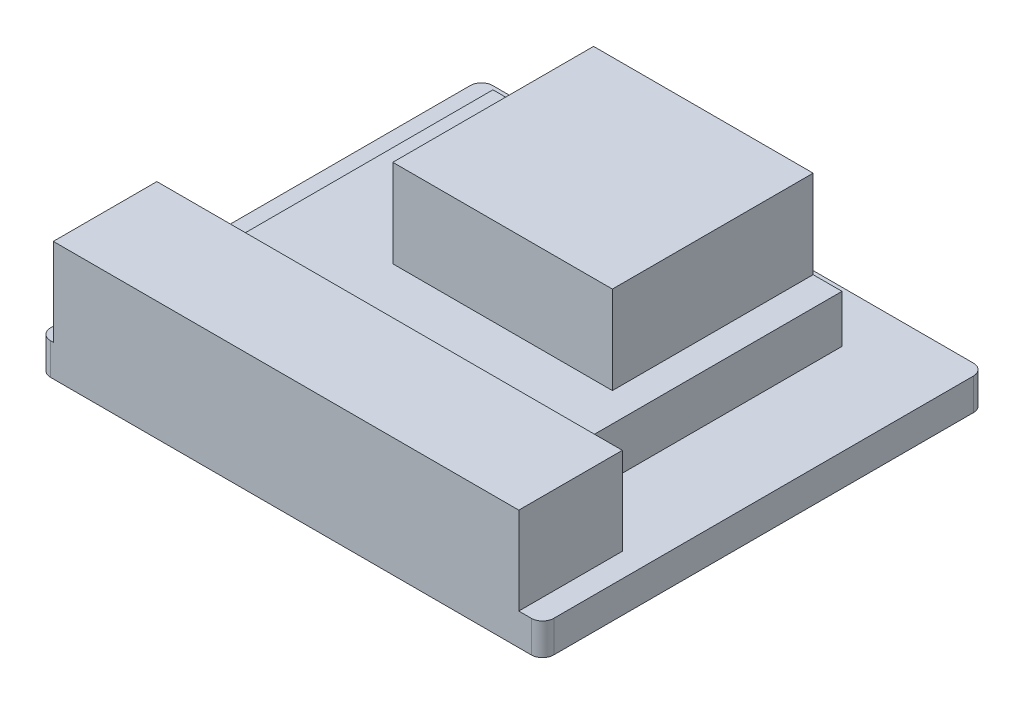
ISO-10303-21;
HEADER;
FILE_DESCRIPTION(('STEP AP214'),'2;1');
FILE_NAME('part.step','',(''),(''),'','','');
FILE_SCHEMA(('AUTOMOTIVE_DESIGN { 1 0 10303 214 1 1 1 1 }'));
ENDSEC;
DATA;
#1=APPLICATION_CONTEXT('core data for automotive mechanical design processes');
#2=APPLICATION_PROTOCOL_DEFINITION('international standard','automotive_design',2000,#1);
#3=PRODUCT_CONTEXT('',#1,'mechanical');
#4=PRODUCT('Part','Part','',(#3));
#5=PRODUCT_RELATED_PRODUCT_CATEGORY('part','',(#4));
#6=PRODUCT_DEFINITION_FORMATION('','',#4);
#7=PRODUCT_DEFINITION_CONTEXT('part definition',#1,'design');
#8=PRODUCT_DEFINITION('design','',#6,#7);
#9=PRODUCT_DEFINITION_SHAPE('','',#8);
#10=(LENGTH_UNIT() NAMED_UNIT(*) SI_UNIT(.MILLI.,.METRE.));
#11=(NAMED_UNIT(*) PLANE_ANGLE_UNIT() SI_UNIT($,.RADIAN.));
#12=(NAMED_UNIT(*) SI_UNIT($,.STERADIAN.) SOLID_ANGLE_UNIT());
#13=UNCERTAINTY_MEASURE_WITH_UNIT(LENGTH_MEASURE(1.E-05),#10,'distance_accuracy_value','');
#14=(GEOMETRIC_REPRESENTATION_CONTEXT(3) GLOBAL_UNCERTAINTY_ASSIGNED_CONTEXT((#13)) GLOBAL_UNIT_ASSIGNED_CONTEXT((#10,
#11,#12)) REPRESENTATION_CONTEXT('',''));
#15=CARTESIAN_POINT('',(0.,0.,0.));
#16=DIRECTION('',(0.,0.,1.));
#17=DIRECTION('',(1.,0.,0.));
#18=AXIS2_PLACEMENT_3D('',#15,#16,#17);
#19=CARTESIAN_POINT('',(-49.2,6.5,42.95));
#20=DIRECTION('',(0.,-1.,0.));
#21=DIRECTION('',(0.,0.,-1.));
#22=AXIS2_PLACEMENT_3D('',#19,#20,#21);
#23=PLANE('',#22);
#24=DIRECTION('',(0.,0.,1.));
#25=VECTOR('',#24,1.);
#26=CARTESIAN_POINT('',(-48.65,6.5,45.25));
#27=LINE('',#26,#25);
#28=CARTESIAN_POINT('',(-48.65,6.5,24.05));
#29=VERTEX_POINT('',#28);
#30=CARTESIAN_POINT('',(-48.65,6.5,45.25));
#31=VERTEX_POINT('',#30);
#32=EDGE_CURVE('E235',#29,#31,#27,.T.);
#33=ORIENTED_EDGE('',*,*,#32,.F.);
#34=DIRECTION('',(-1.,0.,0.));
#35=VECTOR('',#34,1.);
#36=CARTESIAN_POINT('',(-48.65,6.5,24.05));
#37=LINE('',#36,#35);
#38=CARTESIAN_POINT('',(46.64,6.5,24.05));
#39=VERTEX_POINT('',#38);
#40=EDGE_CURVE('E240',#39,#29,#37,.T.);
#41=ORIENTED_EDGE('',*,*,#40,.F.);
#42=DIRECTION('',(0.,0.,-1.));
#43=VECTOR('',#42,1.);
#44=CARTESIAN_POINT('',(46.64,6.5,45.25));
#45=LINE('',#44,#43);
#46=CARTESIAN_POINT('',(46.64,6.5,45.25));
#47=VERTEX_POINT('',#46);
#48=EDGE_CURVE('E249',#47,#39,#45,.T.);
#49=ORIENTED_EDGE('',*,*,#48,.F.);
#50=DIRECTION('',(1.,0.,0.));
#51=VECTOR('',#50,1.);
#52=CARTESIAN_POINT('',(49.2,6.5,45.25));
#53=LINE('',#52,#51);
#54=CARTESIAN_POINT('',(49.2,6.5,45.25));
#55=VERTEX_POINT('',#54);
#56=EDGE_CURVE('E269',#47,#55,#53,.T.);
#57=ORIENTED_EDGE('',*,*,#56,.T.);
#58=CARTESIAN_POINT('',(49.2,6.5,42.95));
#59=DIRECTION('',(0.,1.,0.));
#60=DIRECTION('',(0.,0.,1.));
#61=AXIS2_PLACEMENT_3D('',#58,#59,#60);
#62=CIRCLE('',#61,2.3);
#63=CARTESIAN_POINT('',(51.5,6.5,42.95));
#64=VERTEX_POINT('',#63);
#65=EDGE_CURVE('E273',#55,#64,#62,.T.);
#66=ORIENTED_EDGE('',*,*,#65,.T.);
#67=DIRECTION('',(0.,0.,-1.));
#68=VECTOR('',#67,1.);
#69=CARTESIAN_POINT('',(51.5,6.5,-42.95));
#70=LINE('',#69,#68);
#71=CARTESIAN_POINT('',(51.5,6.5,-42.95));
#72=VERTEX_POINT('',#71);
#73=EDGE_CURVE('E275',#64,#72,#70,.T.);
#74=ORIENTED_EDGE('',*,*,#73,.T.);
#75=CARTESIAN_POINT('',(49.2,6.5,-42.95));
#76=DIRECTION('',(0.,1.,0.));
#77=DIRECTION('',(0.,0.,-1.));
#78=AXIS2_PLACEMENT_3D('',#75,#76,#77);
#79=CIRCLE('',#78,2.3);
#80=CARTESIAN_POINT('',(49.2,6.5,-45.25));
#81=VERTEX_POINT('',#80);
#82=EDGE_CURVE('E277',#72,#81,#79,.T.);
#83=ORIENTED_EDGE('',*,*,#82,.T.);
#84=DIRECTION('',(-1.,0.,0.));
#85=VECTOR('',#84,1.);
#86=CARTESIAN_POINT('',(-49.2,6.5,-45.25));
#87=LINE('',#86,#85);
#88=CARTESIAN_POINT('',(-49.2,6.5,-45.25));
#89=VERTEX_POINT('',#88);
#90=EDGE_CURVE('E279',#81,#89,#87,.T.);
#91=ORIENTED_EDGE('',*,*,#90,.T.);
#92=CARTESIAN_POINT('',(-49.2,6.5,-42.95));
#93=DIRECTION('',(0.,1.,0.));
#94=DIRECTION('',(0.,0.,-1.));
#95=AXIS2_PLACEMENT_3D('',#92,#93,#94);
#96=CIRCLE('',#95,2.3);
#97=CARTESIAN_POINT('',(-51.5,6.5,-42.95));
#98=VERTEX_POINT('',#97);
#99=EDGE_CURVE('E281',#89,#98,#96,.T.);
#100=ORIENTED_EDGE('',*,*,#99,.T.);
#101=DIRECTION('',(0.,0.,1.));
#102=VECTOR('',#101,1.);
#103=CARTESIAN_POINT('',(-51.5,6.5,42.95));
#104=LINE('',#103,#102);
#105=CARTESIAN_POINT('',(-51.5,6.5,42.95));
#106=VERTEX_POINT('',#105);
#107=EDGE_CURVE('E283',#98,#106,#104,.T.);
#108=ORIENTED_EDGE('',*,*,#107,.T.);
#109=CARTESIAN_POINT('',(-49.2,6.5,42.95));
#110=DIRECTION('',(0.,1.,0.));
#111=DIRECTION('',(0.,0.,-1.));
#112=AXIS2_PLACEMENT_3D('',#109,#110,#111);
#113=CIRCLE('',#112,2.30000000000001);
#114=CARTESIAN_POINT('',(-49.2,6.5,45.25));
#115=VERTEX_POINT('',#114);
#116=EDGE_CURVE('E266',#106,#115,#113,.T.);
#117=ORIENTED_EDGE('',*,*,#116,.T.);
#118=EDGE_CURVE('E271',#115,#31,#53,.T.);
#119=ORIENTED_EDGE('',*,*,#118,.T.);
#120=EDGE_LOOP('',(#33,#41,#49,#57,#66,#74,#83,#91,#100,#108,#117,#119));
#121=FACE_BOUND('',#120,.T.);
#122=DIRECTION('',(0.,0.,1.));
#123=VECTOR('',#122,1.);
#124=CARTESIAN_POINT('',(-38.65,6.5,-34.75));
#125=LINE('',#124,#123);
#126=CARTESIAN_POINT('',(-38.65,6.5,-34.75));
#127=VERTEX_POINT('',#126);
#128=CARTESIAN_POINT('',(-38.65,6.5,16.25));
#129=VERTEX_POINT('',#128);
#130=EDGE_CURVE('E196',#127,#129,#125,.T.);
#131=ORIENTED_EDGE('',*,*,#130,.F.);
#132=DIRECTION('',(-1.,0.,0.));
#133=VECTOR('',#132,1.);
#134=CARTESIAN_POINT('',(-38.65,6.5,-34.75));
#135=LINE('',#134,#133);
#136=CARTESIAN_POINT('',(32.8,6.5,-34.75));
#137=VERTEX_POINT('',#136);
#138=EDGE_CURVE('E209',#137,#127,#135,.T.);
#139=ORIENTED_EDGE('',*,*,#138,.F.);
#140=DIRECTION('',(0.,0.,-1.));
#141=VECTOR('',#140,1.);
#142=CARTESIAN_POINT('',(32.8,6.5,-34.75));
#143=LINE('',#142,#141);
#144=CARTESIAN_POINT('',(32.8,6.5,16.25));
#145=VERTEX_POINT('',#144);
#146=EDGE_CURVE('E219',#145,#137,#143,.T.);
#147=ORIENTED_EDGE('',*,*,#146,.F.);
#148=DIRECTION('',(1.,0.,0.));
#149=VECTOR('',#148,1.);
#150=CARTESIAN_POINT('',(-38.65,6.5,16.25));
#151=LINE('',#150,#149);
#152=EDGE_CURVE('E199',#129,#145,#151,.T.);
#153=ORIENTED_EDGE('',*,*,#152,.F.);
#154=EDGE_LOOP('',(#131,#139,#147,#153));
#155=FACE_BOUND('',#154,.T.);
#156=ADVANCED_FACE('F39',(#121,#155),#23,.F.);
#157=CARTESIAN_POINT('',(-49.2,6.5,42.95));
#158=DIRECTION('',(0.,-1.,0.));
#159=DIRECTION('',(0.,0.,-1.));
#160=AXIS2_PLACEMENT_3D('',#157,#158,#159);
#161=CYLINDRICAL_SURFACE('',#160,2.30000000000001);
#162=CARTESIAN_POINT('',(-49.2,0.,42.95));
#163=DIRECTION('',(0.,1.,0.));
#164=DIRECTION('',(0.,0.,-1.));
#165=AXIS2_PLACEMENT_3D('',#162,#163,#164);
#166=CIRCLE('',#165,2.30000000000001);
#167=CARTESIAN_POINT('',(-51.5,0.,42.95));
#168=VERTEX_POINT('',#167);
#169=CARTESIAN_POINT('',(-49.2,0.,45.25));
#170=VERTEX_POINT('',#169);
#171=EDGE_CURVE('E265',#168,#170,#166,.T.);
#172=ORIENTED_EDGE('',*,*,#171,.T.);
#173=DIRECTION('',(0.,-1.,0.));
#174=VECTOR('',#173,1.);
#175=CARTESIAN_POINT('',(-49.2,6.5,45.25));
#176=LINE('',#175,#174);
#177=EDGE_CURVE('E11',#115,#170,#176,.T.);
#178=ORIENTED_EDGE('',*,*,#177,.F.);
#179=ORIENTED_EDGE('',*,*,#116,.F.);
#180=DIRECTION('',(0.,-1.,0.));
#181=VECTOR('',#180,1.);
#182=CARTESIAN_POINT('',(-51.5,6.5,42.95));
#183=LINE('',#182,#181);
#184=EDGE_CURVE('E285',#106,#168,#183,.T.);
#185=ORIENTED_EDGE('',*,*,#184,.T.);
#186=EDGE_LOOP('',(#172,#178,#179,#185));
#187=FACE_BOUND('',#186,.T.);
#188=ADVANCED_FACE('F41',(#187),#161,.T.);
#189=CARTESIAN_POINT('',(49.2,6.5,45.25));
#190=DIRECTION('',(0.,0.,-1.));
#191=DIRECTION('',(-1.,0.,0.));
#192=AXIS2_PLACEMENT_3D('',#189,#190,#191);
#193=PLANE('',#192);
#194=DIRECTION('',(1.,0.,0.));
#195=VECTOR('',#194,1.);
#196=CARTESIAN_POINT('',(49.2,0.,45.25));
#197=LINE('',#196,#195);
#198=CARTESIAN_POINT('',(49.2,0.,45.25));
#199=VERTEX_POINT('',#198);
#200=EDGE_CURVE('E288',#170,#199,#197,.T.);
#201=ORIENTED_EDGE('',*,*,#200,.T.);
#202=DIRECTION('',(0.,-1.,0.));
#203=VECTOR('',#202,1.);
#204=CARTESIAN_POINT('',(49.2,6.5,45.25));
#205=LINE('',#204,#203);
#206=EDGE_CURVE('E47',#55,#199,#205,.T.);
#207=ORIENTED_EDGE('',*,*,#206,.F.);
#208=ORIENTED_EDGE('',*,*,#56,.F.);
#209=DIRECTION('',(0.,-1.,0.));
#210=VECTOR('',#209,1.);
#211=CARTESIAN_POINT('',(46.64,24.4,45.25));
#212=LINE('',#211,#210);
#213=CARTESIAN_POINT('',(46.64,24.4,45.25));
#214=VERTEX_POINT('',#213);
#215=EDGE_CURVE('E259',#214,#47,#212,.T.);
#216=ORIENTED_EDGE('',*,*,#215,.F.);
#217=DIRECTION('',(1.,0.,0.));
#218=VECTOR('',#217,1.);
#219=CARTESIAN_POINT('',(-48.65,24.4,45.25));
#220=LINE('',#219,#218);
#221=CARTESIAN_POINT('',(-48.65,24.4,45.25));
#222=VERTEX_POINT('',#221);
#223=EDGE_CURVE('E239',#222,#214,#220,.T.);
#224=ORIENTED_EDGE('',*,*,#223,.F.);
#225=DIRECTION('',(0.,-1.,0.));
#226=VECTOR('',#225,1.);
#227=CARTESIAN_POINT('',(-48.65,24.4,45.25));
#228=LINE('',#227,#226);
#229=EDGE_CURVE('E262',#222,#31,#228,.T.);
#230=ORIENTED_EDGE('',*,*,#229,.T.);
#231=ORIENTED_EDGE('',*,*,#118,.F.);
#232=ORIENTED_EDGE('',*,*,#177,.T.);
#233=EDGE_LOOP('',(#201,#207,#208,#216,#224,#230,#231,#232));
#234=FACE_BOUND('',#233,.T.);
#235=ADVANCED_FACE('F345',(#234),#193,.F.);
#236=CARTESIAN_POINT('',(49.2,6.5,42.95));
#237=DIRECTION('',(0.,-1.,0.));
#238=DIRECTION('',(0.,0.,-1.));
#239=AXIS2_PLACEMENT_3D('',#236,#237,#238);
#240=CYLINDRICAL_SURFACE('',#239,2.3);
#241=CARTESIAN_POINT('',(49.2,0.,42.95));
#242=DIRECTION('',(0.,1.,0.));
#243=DIRECTION('',(0.,0.,1.));
#244=AXIS2_PLACEMENT_3D('',#241,#242,#243);
#245=CIRCLE('',#244,2.3);
#246=CARTESIAN_POINT('',(51.5,0.,42.95));
#247=VERTEX_POINT('',#246);
#248=EDGE_CURVE('E290',#199,#247,#245,.T.);
#249=ORIENTED_EDGE('',*,*,#248,.T.);
#250=DIRECTION('',(0.,-1.,0.));
#251=VECTOR('',#250,1.);
#252=CARTESIAN_POINT('',(51.5,6.5,42.95));
#253=LINE('',#252,#251);
#254=EDGE_CURVE('E315',#64,#247,#253,.T.);
#255=ORIENTED_EDGE('',*,*,#254,.F.);
#256=ORIENTED_EDGE('',*,*,#65,.F.);
#257=ORIENTED_EDGE('',*,*,#206,.T.);
#258=EDGE_LOOP('',(#249,#255,#256,#257));
#259=FACE_BOUND('',#258,.T.);
#260=ADVANCED_FACE('F322',(#259),#240,.T.);
#261=CARTESIAN_POINT('',(51.5,6.5,-42.95));
#262=DIRECTION('',(-1.,0.,0.));
#263=DIRECTION('',(0.,0.,1.));
#264=AXIS2_PLACEMENT_3D('',#261,#262,#263);
#265=PLANE('',#264);
#266=DIRECTION('',(0.,0.,-1.));
#267=VECTOR('',#266,1.);
#268=CARTESIAN_POINT('',(51.5,0.,-42.95));
#269=LINE('',#268,#267);
#270=CARTESIAN_POINT('',(51.5,0.,-42.95));
#271=VERTEX_POINT('',#270);
#272=EDGE_CURVE('E292',#247,#271,#269,.T.);
#273=ORIENTED_EDGE('',*,*,#272,.T.);
#274=DIRECTION('',(0.,-1.,0.));
#275=VECTOR('',#274,1.);
#276=CARTESIAN_POINT('',(51.5,6.5,-42.95));
#277=LINE('',#276,#275);
#278=EDGE_CURVE('E312',#72,#271,#277,.T.);
#279=ORIENTED_EDGE('',*,*,#278,.F.);
#280=ORIENTED_EDGE('',*,*,#73,.F.);
#281=ORIENTED_EDGE('',*,*,#254,.T.);
#282=EDGE_LOOP('',(#273,#279,#280,#281));
#283=FACE_BOUND('',#282,.T.);
#284=ADVANCED_FACE('F334',(#283),#265,.F.);
#285=CARTESIAN_POINT('',(49.2,6.5,-42.95));
#286=DIRECTION('',(0.,-1.,0.));
#287=DIRECTION('',(0.,0.,-1.));
#288=AXIS2_PLACEMENT_3D('',#285,#286,#287);
#289=CYLINDRICAL_SURFACE('',#288,2.3);
#290=CARTESIAN_POINT('',(49.2,0.,-42.95));
#291=DIRECTION('',(0.,1.,0.));
#292=DIRECTION('',(0.,0.,-1.));
#293=AXIS2_PLACEMENT_3D('',#290,#291,#292);
#294=CIRCLE('',#293,2.3);
#295=CARTESIAN_POINT('',(49.2,0.,-45.25));
#296=VERTEX_POINT('',#295);
#297=EDGE_CURVE('E294',#271,#296,#294,.T.);
#298=ORIENTED_EDGE('',*,*,#297,.T.);
#299=DIRECTION('',(0.,-1.,0.));
#300=VECTOR('',#299,1.);
#301=CARTESIAN_POINT('',(49.2,6.5,-45.25));
#302=LINE('',#301,#300);
#303=EDGE_CURVE('E309',#81,#296,#302,.T.);
#304=ORIENTED_EDGE('',*,*,#303,.F.);
#305=ORIENTED_EDGE('',*,*,#82,.F.);
#306=ORIENTED_EDGE('',*,*,#278,.T.);
#307=EDGE_LOOP('',(#298,#304,#305,#306));
#308=FACE_BOUND('',#307,.T.);
#309=ADVANCED_FACE('F338',(#308),#289,.T.);
#310=CARTESIAN_POINT('',(-49.2,6.5,-45.25));
#311=DIRECTION('',(0.,0.,1.));
#312=DIRECTION('',(1.,0.,0.));
#313=AXIS2_PLACEMENT_3D('',#310,#311,#312);
#314=PLANE('',#313);
#315=DIRECTION('',(-1.,0.,0.));
#316=VECTOR('',#315,1.);
#317=CARTESIAN_POINT('',(-49.2,0.,-45.25));
#318=LINE('',#317,#316);
#319=CARTESIAN_POINT('',(-49.2,0.,-45.25));
#320=VERTEX_POINT('',#319);
#321=EDGE_CURVE('E296',#296,#320,#318,.T.);
#322=ORIENTED_EDGE('',*,*,#321,.T.);
#323=DIRECTION('',(0.,-1.,0.));
#324=VECTOR('',#323,1.);
#325=CARTESIAN_POINT('',(-49.2,6.5,-45.25));
#326=LINE('',#325,#324);
#327=EDGE_CURVE('E306',#89,#320,#326,.T.);
#328=ORIENTED_EDGE('',*,*,#327,.F.);
#329=ORIENTED_EDGE('',*,*,#90,.F.);
#330=ORIENTED_EDGE('',*,*,#303,.T.);
#331=EDGE_LOOP('',(#322,#328,#329,#330));
#332=FACE_BOUND('',#331,.T.);
#333=ADVANCED_FACE('F387',(#332),#314,.F.);
#334=CARTESIAN_POINT('',(-49.2,6.5,-42.95));
#335=DIRECTION('',(0.,-1.,0.));
#336=DIRECTION('',(0.,0.,-1.));
#337=AXIS2_PLACEMENT_3D('',#334,#335,#336);
#338=CYLINDRICAL_SURFACE('',#337,2.3);
#339=CARTESIAN_POINT('',(-49.2,0.,-42.95));
#340=DIRECTION('',(0.,1.,0.));
#341=DIRECTION('',(0.,0.,-1.));
#342=AXIS2_PLACEMENT_3D('',#339,#340,#341);
#343=CIRCLE('',#342,2.3);
#344=CARTESIAN_POINT('',(-51.5,0.,-42.95));
#345=VERTEX_POINT('',#344);
#346=EDGE_CURVE('E298',#320,#345,#343,.T.);
#347=ORIENTED_EDGE('',*,*,#346,.T.);
#348=DIRECTION('',(0.,-1.,0.));
#349=VECTOR('',#348,1.);
#350=CARTESIAN_POINT('',(-51.5,6.5,-42.95));
#351=LINE('',#350,#349);
#352=EDGE_CURVE('E303',#98,#345,#351,.T.);
#353=ORIENTED_EDGE('',*,*,#352,.F.);
#354=ORIENTED_EDGE('',*,*,#99,.F.);
#355=ORIENTED_EDGE('',*,*,#327,.T.);
#356=EDGE_LOOP('',(#347,#353,#354,#355));
#357=FACE_BOUND('',#356,.T.);
#358=ADVANCED_FACE('F383',(#357),#338,.T.);
#359=CARTESIAN_POINT('',(-51.5,6.5,42.95));
#360=DIRECTION('',(1.,0.,0.));
#361=DIRECTION('',(0.,0.,-1.));
#362=AXIS2_PLACEMENT_3D('',#359,#360,#361);
#363=PLANE('',#362);
#364=DIRECTION('',(0.,0.,1.));
#365=VECTOR('',#364,1.);
#366=CARTESIAN_POINT('',(-51.5,0.,42.95));
#367=LINE('',#366,#365);
#368=EDGE_CURVE('E270',#345,#168,#367,.T.);
#369=ORIENTED_EDGE('',*,*,#368,.T.);
#370=ORIENTED_EDGE('',*,*,#184,.F.);
#371=ORIENTED_EDGE('',*,*,#107,.F.);
#372=ORIENTED_EDGE('',*,*,#352,.T.);
#373=EDGE_LOOP('',(#369,#370,#371,#372));
#374=FACE_BOUND('',#373,.T.);
#375=ADVANCED_FACE('F380',(#374),#363,.F.);
#376=CARTESIAN_POINT('',(-49.2,0.,42.95));
#377=DIRECTION('',(0.,-1.,0.));
#378=DIRECTION('',(0.,0.,-1.));
#379=AXIS2_PLACEMENT_3D('',#376,#377,#378);
#380=PLANE('',#379);
#381=ORIENTED_EDGE('',*,*,#171,.F.);
#382=ORIENTED_EDGE('',*,*,#368,.F.);
#383=ORIENTED_EDGE('',*,*,#346,.F.);
#384=ORIENTED_EDGE('',*,*,#321,.F.);
#385=ORIENTED_EDGE('',*,*,#297,.F.);
#386=ORIENTED_EDGE('',*,*,#272,.F.);
#387=ORIENTED_EDGE('',*,*,#248,.F.);
#388=ORIENTED_EDGE('',*,*,#200,.F.);
#389=EDGE_LOOP('',(#381,#382,#383,#384,#385,#386,#387,#388));
#390=FACE_BOUND('',#389,.T.);
#391=ADVANCED_FACE('F329',(#390),#380,.T.);
#392=CARTESIAN_POINT('',(-48.65,24.4,45.25));
#393=DIRECTION('',(1.,0.,0.));
#394=DIRECTION('',(0.,0.,-1.));
#395=AXIS2_PLACEMENT_3D('',#392,#393,#394);
#396=PLANE('',#395);
#397=ORIENTED_EDGE('',*,*,#32,.T.);
#398=ORIENTED_EDGE('',*,*,#229,.F.);
#399=DIRECTION('',(0.,0.,1.));
#400=VECTOR('',#399,1.);
#401=CARTESIAN_POINT('',(-48.65,24.4,45.25));
#402=LINE('',#401,#400);
#403=CARTESIAN_POINT('',(-48.65,24.4,24.05));
#404=VERTEX_POINT('',#403);
#405=EDGE_CURVE('E236',#404,#222,#402,.T.);
#406=ORIENTED_EDGE('',*,*,#405,.F.);
#407=DIRECTION('',(0.,-1.,0.));
#408=VECTOR('',#407,1.);
#409=CARTESIAN_POINT('',(-48.65,24.4,24.05));
#410=LINE('',#409,#408);
#411=EDGE_CURVE('E246',#404,#29,#410,.T.);
#412=ORIENTED_EDGE('',*,*,#411,.T.);
#413=EDGE_LOOP('',(#397,#398,#406,#412));
#414=FACE_BOUND('',#413,.T.);
#415=ADVANCED_FACE('F357',(#414),#396,.F.);
#416=CARTESIAN_POINT('',(46.64,24.4,45.25));
#417=DIRECTION('',(-1.,0.,0.));
#418=DIRECTION('',(0.,0.,1.));
#419=AXIS2_PLACEMENT_3D('',#416,#417,#418);
#420=PLANE('',#419);
#421=ORIENTED_EDGE('',*,*,#48,.T.);
#422=DIRECTION('',(0.,-1.,0.));
#423=VECTOR('',#422,1.);
#424=CARTESIAN_POINT('',(46.64,24.4,24.05));
#425=LINE('',#424,#423);
#426=CARTESIAN_POINT('',(46.64,24.4,24.05));
#427=VERTEX_POINT('',#426);
#428=EDGE_CURVE('E256',#427,#39,#425,.T.);
#429=ORIENTED_EDGE('',*,*,#428,.F.);
#430=DIRECTION('',(0.,0.,-1.));
#431=VECTOR('',#430,1.);
#432=CARTESIAN_POINT('',(46.64,24.4,45.25));
#433=LINE('',#432,#431);
#434=EDGE_CURVE('E242',#214,#427,#433,.T.);
#435=ORIENTED_EDGE('',*,*,#434,.F.);
#436=ORIENTED_EDGE('',*,*,#215,.T.);
#437=EDGE_LOOP('',(#421,#429,#435,#436));
#438=FACE_BOUND('',#437,.T.);
#439=ADVANCED_FACE('F348',(#438),#420,.F.);
#440=CARTESIAN_POINT('',(-48.65,24.4,24.05));
#441=DIRECTION('',(0.,0.,1.));
#442=DIRECTION('',(1.,0.,0.));
#443=AXIS2_PLACEMENT_3D('',#440,#441,#442);
#444=PLANE('',#443);
#445=ORIENTED_EDGE('',*,*,#40,.T.);
#446=ORIENTED_EDGE('',*,*,#411,.F.);
#447=DIRECTION('',(-1.,0.,0.));
#448=VECTOR('',#447,1.);
#449=CARTESIAN_POINT('',(-48.65,24.4,24.05));
#450=LINE('',#449,#448);
#451=EDGE_CURVE('E244',#427,#404,#450,.T.);
#452=ORIENTED_EDGE('',*,*,#451,.F.);
#453=ORIENTED_EDGE('',*,*,#428,.T.);
#454=EDGE_LOOP('',(#445,#446,#452,#453));
#455=FACE_BOUND('',#454,.T.);
#456=ADVANCED_FACE('F359',(#455),#444,.F.);
#457=CARTESIAN_POINT('',(0.,24.4,0.));
#458=DIRECTION('',(0.,-1.,0.));
#459=DIRECTION('',(0.,0.,-1.));
#460=AXIS2_PLACEMENT_3D('',#457,#458,#459);
#461=PLANE('',#460);
#462=ORIENTED_EDGE('',*,*,#405,.T.);
#463=ORIENTED_EDGE('',*,*,#223,.T.);
#464=ORIENTED_EDGE('',*,*,#434,.T.);
#465=ORIENTED_EDGE('',*,*,#451,.T.);
#466=EDGE_LOOP('',(#462,#463,#464,#465));
#467=FACE_BOUND('',#466,.T.);
#468=ADVANCED_FACE('F352',(#467),#461,.F.);
#469=CARTESIAN_POINT('',(-38.65,16.27,-34.75));
#470=DIRECTION('',(1.,0.,0.));
#471=DIRECTION('',(0.,0.,-1.));
#472=AXIS2_PLACEMENT_3D('',#469,#470,#471);
#473=PLANE('',#472);
#474=ORIENTED_EDGE('',*,*,#130,.T.);
#475=DIRECTION('',(0.,-1.,0.));
#476=VECTOR('',#475,1.);
#477=CARTESIAN_POINT('',(-38.65,16.27,16.25));
#478=LINE('',#477,#476);
#479=CARTESIAN_POINT('',(-38.65,16.27,16.25));
#480=VERTEX_POINT('',#479);
#481=EDGE_CURVE('E232',#480,#129,#478,.T.);
#482=ORIENTED_EDGE('',*,*,#481,.F.);
#483=DIRECTION('',(0.,0.,1.));
#484=VECTOR('',#483,1.);
#485=CARTESIAN_POINT('',(-38.65,16.27,-34.75));
#486=LINE('',#485,#484);
#487=CARTESIAN_POINT('',(-38.65,16.27,-34.75));
#488=VERTEX_POINT('',#487);
#489=EDGE_CURVE('E205',#488,#480,#486,.T.);
#490=ORIENTED_EDGE('',*,*,#489,.F.);
#491=DIRECTION('',(0.,-1.,0.));
#492=VECTOR('',#491,1.);
#493=CARTESIAN_POINT('',(-38.65,16.27,-34.75));
#494=LINE('',#493,#492);
#495=EDGE_CURVE('E215',#488,#127,#494,.T.);
#496=ORIENTED_EDGE('',*,*,#495,.T.);
#497=EDGE_LOOP('',(#474,#482,#490,#496));
#498=FACE_BOUND('',#497,.T.);
#499=ADVANCED_FACE('F366',(#498),#473,.F.);
#500=CARTESIAN_POINT('',(-38.65,16.27,16.25));
#501=DIRECTION('',(0.,0.,-1.));
#502=DIRECTION('',(-1.,0.,0.));
#503=AXIS2_PLACEMENT_3D('',#500,#501,#502);
#504=PLANE('',#503);
#505=ORIENTED_EDGE('',*,*,#152,.T.);
#506=DIRECTION('',(0.,-1.,0.));
#507=VECTOR('',#506,1.);
#508=CARTESIAN_POINT('',(32.8,16.27,16.25));
#509=LINE('',#508,#507);
#510=CARTESIAN_POINT('',(32.8,16.27,16.25));
#511=VERTEX_POINT('',#510);
#512=EDGE_CURVE('E229',#511,#145,#509,.T.);
#513=ORIENTED_EDGE('',*,*,#512,.F.);
#514=DIRECTION('',(1.,0.,0.));
#515=VECTOR('',#514,1.);
#516=CARTESIAN_POINT('',(-38.65,16.27,16.25));
#517=LINE('',#516,#515);
#518=EDGE_CURVE('E208',#480,#511,#517,.T.);
#519=ORIENTED_EDGE('',*,*,#518,.F.);
#520=ORIENTED_EDGE('',*,*,#481,.T.);
#521=EDGE_LOOP('',(#505,#513,#519,#520));
#522=FACE_BOUND('',#521,.T.);
#523=ADVANCED_FACE('F436',(#522),#504,.F.);
#524=CARTESIAN_POINT('',(32.8,16.27,-34.75));
#525=DIRECTION('',(-1.,0.,0.));
#526=DIRECTION('',(0.,0.,1.));
#527=AXIS2_PLACEMENT_3D('',#524,#525,#526);
#528=PLANE('',#527);
#529=ORIENTED_EDGE('',*,*,#146,.T.);
#530=DIRECTION('',(0.,-1.,0.));
#531=VECTOR('',#530,1.);
#532=CARTESIAN_POINT('',(32.8,16.27,-34.75));
#533=LINE('',#532,#531);
#534=CARTESIAN_POINT('',(32.8,16.27,-34.75));
#535=VERTEX_POINT('',#534);
#536=EDGE_CURVE('E226',#535,#137,#533,.T.);
#537=ORIENTED_EDGE('',*,*,#536,.F.);
#538=DIRECTION('',(0.,0.,-1.));
#539=VECTOR('',#538,1.);
#540=CARTESIAN_POINT('',(32.8,16.27,-34.75));
#541=LINE('',#540,#539);
#542=EDGE_CURVE('E211',#511,#535,#541,.T.);
#543=ORIENTED_EDGE('',*,*,#542,.F.);
#544=ORIENTED_EDGE('',*,*,#512,.T.);
#545=EDGE_LOOP('',(#529,#537,#543,#544));
#546=FACE_BOUND('',#545,.T.);
#547=ADVANCED_FACE('F446',(#546),#528,.F.);
#548=CARTESIAN_POINT('',(-38.65,16.27,-34.75));
#549=DIRECTION('',(0.,0.,1.));
#550=DIRECTION('',(1.,0.,0.));
#551=AXIS2_PLACEMENT_3D('',#548,#549,#550);
#552=PLANE('',#551);
#553=ORIENTED_EDGE('',*,*,#138,.T.);
#554=ORIENTED_EDGE('',*,*,#495,.F.);
#555=DIRECTION('',(-1.,0.,0.));
#556=VECTOR('',#555,1.);
#557=CARTESIAN_POINT('',(-38.65,16.27,-34.75));
#558=LINE('',#557,#556);
#559=CARTESIAN_POINT('',(-18.05,16.27,-34.75));
#560=VERTEX_POINT('',#559);
#561=EDGE_CURVE('E213',#560,#488,#558,.T.);
#562=ORIENTED_EDGE('',*,*,#561,.F.);
#563=DIRECTION('',(0.,-1.,0.));
#564=VECTOR('',#563,1.);
#565=CARTESIAN_POINT('',(-18.05,34.27,-34.75));
#566=LINE('',#565,#564);
#567=CARTESIAN_POINT('',(-18.05,34.27,-34.75));
#568=VERTEX_POINT('',#567);
#569=EDGE_CURVE('E520',#568,#560,#566,.T.);
#570=ORIENTED_EDGE('',*,*,#569,.F.);
#571=DIRECTION('',(-1.,0.,0.));
#572=VECTOR('',#571,1.);
#573=CARTESIAN_POINT('',(-18.05,34.27,-34.75));
#574=LINE('',#573,#572);
#575=CARTESIAN_POINT('',(26.9,34.27,-34.75));
#576=VERTEX_POINT('',#575);
#577=EDGE_CURVE('E189',#576,#568,#574,.T.);
#578=ORIENTED_EDGE('',*,*,#577,.F.);
#579=DIRECTION('',(0.,-1.,0.));
#580=VECTOR('',#579,1.);
#581=CARTESIAN_POINT('',(26.9,34.27,-34.75));
#582=LINE('',#581,#580);
#583=CARTESIAN_POINT('',(26.9,16.27,-34.75));
#584=VERTEX_POINT('',#583);
#585=EDGE_CURVE('E201',#576,#584,#582,.T.);
#586=ORIENTED_EDGE('',*,*,#585,.T.);
#587=EDGE_CURVE('E214',#535,#584,#558,.T.);
#588=ORIENTED_EDGE('',*,*,#587,.F.);
#589=ORIENTED_EDGE('',*,*,#536,.T.);
#590=EDGE_LOOP('',(#553,#554,#562,#570,#578,#586,#588,#589));
#591=FACE_BOUND('',#590,.T.);
#592=ADVANCED_FACE('F456',(#591),#552,.F.);
#593=CARTESIAN_POINT('',(0.,16.27,0.));
#594=DIRECTION('',(0.,1.,0.));
#595=DIRECTION('',(0.,0.,1.));
#596=AXIS2_PLACEMENT_3D('',#593,#594,#595);
#597=PLANE('',#596);
#598=DIRECTION('',(0.,0.,1.));
#599=VECTOR('',#598,1.);
#600=CARTESIAN_POINT('',(-18.05,16.27,-34.75));
#601=LINE('',#600,#599);
#602=CARTESIAN_POINT('',(-18.05,16.27,6.34999999999999));
#603=VERTEX_POINT('',#602);
#604=EDGE_CURVE('E59',#560,#603,#601,.T.);
#605=ORIENTED_EDGE('',*,*,#604,.F.);
#606=ORIENTED_EDGE('',*,*,#561,.T.);
#607=ORIENTED_EDGE('',*,*,#489,.T.);
#608=ORIENTED_EDGE('',*,*,#518,.T.);
#609=ORIENTED_EDGE('',*,*,#542,.T.);
#610=ORIENTED_EDGE('',*,*,#587,.T.);
#611=DIRECTION('',(0.,0.,-1.));
#612=VECTOR('',#611,1.);
#613=CARTESIAN_POINT('',(26.9,16.27,-34.75));
#614=LINE('',#613,#612);
#615=CARTESIAN_POINT('',(26.9,16.27,6.34999999999999));
#616=VERTEX_POINT('',#615);
#617=EDGE_CURVE('E193',#616,#584,#614,.T.);
#618=ORIENTED_EDGE('',*,*,#617,.F.);
#619=DIRECTION('',(1.,0.,0.));
#620=VECTOR('',#619,1.);
#621=CARTESIAN_POINT('',(-18.05,16.27,6.34999999999999));
#622=LINE('',#621,#620);
#623=EDGE_CURVE('E54',#603,#616,#622,.T.);
#624=ORIENTED_EDGE('',*,*,#623,.F.);
#625=EDGE_LOOP('',(#605,#606,#607,#608,#609,#610,#618,#624));
#626=FACE_BOUND('',#625,.T.);
#627=ADVANCED_FACE('F467',(#626),#597,.T.);
#628=CARTESIAN_POINT('',(-18.05,34.27,-34.75));
#629=DIRECTION('',(1.,0.,0.));
#630=DIRECTION('',(0.,0.,-1.));
#631=AXIS2_PLACEMENT_3D('',#628,#629,#630);
#632=PLANE('',#631);
#633=ORIENTED_EDGE('',*,*,#604,.T.);
#634=DIRECTION('',(0.,-1.,0.));
#635=VECTOR('',#634,1.);
#636=CARTESIAN_POINT('',(-18.05,34.27,6.34999999999999));
#637=LINE('',#636,#635);
#638=CARTESIAN_POINT('',(-18.05,34.27,6.34999999999999));
#639=VERTEX_POINT('',#638);
#640=EDGE_CURVE('E178',#639,#603,#637,.T.);
#641=ORIENTED_EDGE('',*,*,#640,.F.);
#642=DIRECTION('',(0.,0.,1.));
#643=VECTOR('',#642,1.);
#644=CARTESIAN_POINT('',(-18.05,34.27,-34.75));
#645=LINE('',#644,#643);
#646=EDGE_CURVE('E184',#568,#639,#645,.T.);
#647=ORIENTED_EDGE('',*,*,#646,.F.);
#648=ORIENTED_EDGE('',*,*,#569,.T.);
#649=EDGE_LOOP('',(#633,#641,#647,#648));
#650=FACE_BOUND('',#649,.T.);
#651=ADVANCED_FACE('F195',(#650),#632,.F.);
#652=CARTESIAN_POINT('',(-18.05,34.27,6.34999999999999));
#653=DIRECTION('',(0.,0.,-1.));
#654=DIRECTION('',(-1.,0.,0.));
#655=AXIS2_PLACEMENT_3D('',#652,#653,#654);
#656=PLANE('',#655);
#657=ORIENTED_EDGE('',*,*,#623,.T.);
#658=DIRECTION('',(0.,-1.,0.));
#659=VECTOR('',#658,1.);
#660=CARTESIAN_POINT('',(26.9,34.27,6.34999999999999));
#661=LINE('',#660,#659);
#662=CARTESIAN_POINT('',(26.9,34.27,6.34999999999999));
#663=VERTEX_POINT('',#662);
#664=EDGE_CURVE('E180',#663,#616,#661,.T.);
#665=ORIENTED_EDGE('',*,*,#664,.F.);
#666=DIRECTION('',(1.,0.,0.));
#667=VECTOR('',#666,1.);
#668=CARTESIAN_POINT('',(-18.05,34.27,6.34999999999999));
#669=LINE('',#668,#667);
#670=EDGE_CURVE('E174',#639,#663,#669,.T.);
#671=ORIENTED_EDGE('',*,*,#670,.F.);
#672=ORIENTED_EDGE('',*,*,#640,.T.);
#673=EDGE_LOOP('',(#657,#665,#671,#672));
#674=FACE_BOUND('',#673,.T.);
#675=ADVANCED_FACE('F176',(#674),#656,.F.);
#676=CARTESIAN_POINT('',(26.9,34.27,-34.75));
#677=DIRECTION('',(-1.,0.,0.));
#678=DIRECTION('',(0.,0.,1.));
#679=AXIS2_PLACEMENT_3D('',#676,#677,#678);
#680=PLANE('',#679);
#681=ORIENTED_EDGE('',*,*,#617,.T.);
#682=ORIENTED_EDGE('',*,*,#585,.F.);
#683=DIRECTION('',(0.,0.,-1.));
#684=VECTOR('',#683,1.);
#685=CARTESIAN_POINT('',(26.9,34.27,-34.75));
#686=LINE('',#685,#684);
#687=EDGE_CURVE('E183',#663,#576,#686,.T.);
#688=ORIENTED_EDGE('',*,*,#687,.F.);
#689=ORIENTED_EDGE('',*,*,#664,.T.);
#690=EDGE_LOOP('',(#681,#682,#688,#689));
#691=FACE_BOUND('',#690,.T.);
#692=ADVANCED_FACE('F492',(#691),#680,.F.);
#693=CARTESIAN_POINT('',(0.,34.27,0.));
#694=DIRECTION('',(0.,1.,0.));
#695=DIRECTION('',(0.,0.,1.));
#696=AXIS2_PLACEMENT_3D('',#693,#694,#695);
#697=PLANE('',#696);
#698=ORIENTED_EDGE('',*,*,#646,.T.);
#699=ORIENTED_EDGE('',*,*,#670,.T.);
#700=ORIENTED_EDGE('',*,*,#687,.T.);
#701=ORIENTED_EDGE('',*,*,#577,.T.);
#702=EDGE_LOOP('',(#698,#699,#700,#701));
#703=FACE_BOUND('',#702,.T.);
#704=ADVANCED_FACE('F187',(#703),#697,.T.);
#705=CLOSED_SHELL('',(#156,#188,#235,#260,#284,#309,#333,#358,#375,#391,#415,#439,#456,#468,
#499,#523,#547,#592,#627,#651,#675,#692,#704));
#706=MANIFOLD_SOLID_BREP('B2',#705);
#707=ADVANCED_BREP_SHAPE_REPRESENTATION('',(#18,#706),#14);
#708=SHAPE_DEFINITION_REPRESENTATION(#9,#707);
ENDSEC;
END-ISO-10303-21;
